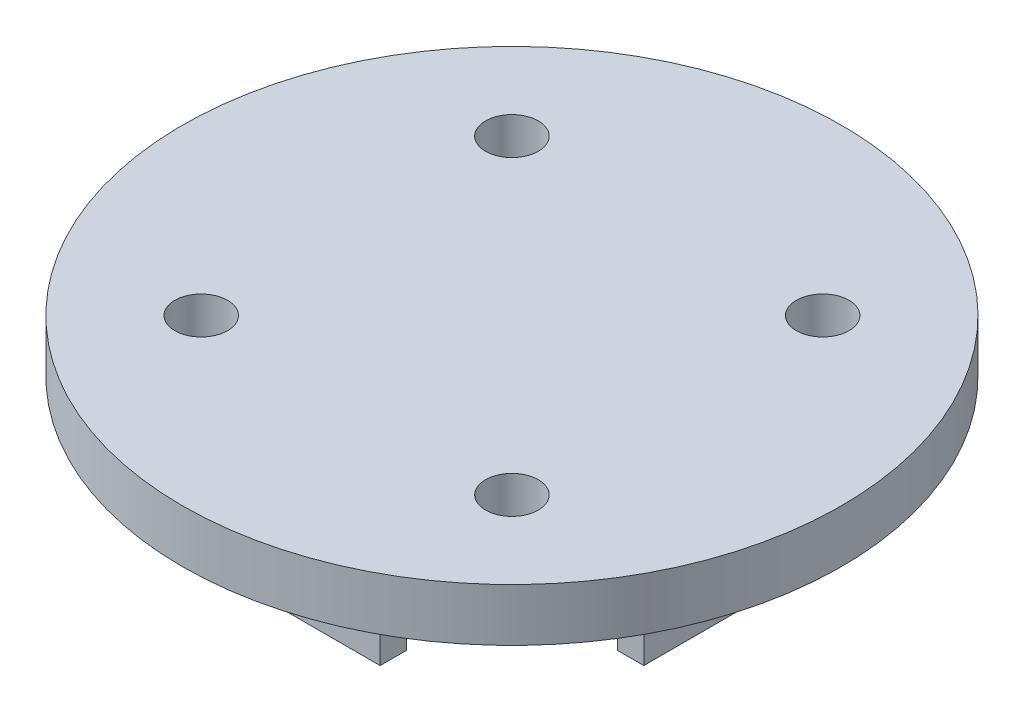
ISO-10303-21;
HEADER;
FILE_DESCRIPTION(('STEP AP214'),'2;1');
FILE_NAME('part.step','',(''),(''),'','','');
FILE_SCHEMA(('AUTOMOTIVE_DESIGN { 1 0 10303 214 1 1 1 1 }'));
ENDSEC;
DATA;
#1=APPLICATION_CONTEXT('core data for automotive mechanical design processes');
#2=APPLICATION_PROTOCOL_DEFINITION('international standard','automotive_design',2000,#1);
#3=PRODUCT_CONTEXT('',#1,'mechanical');
#4=PRODUCT('Part','Part','',(#3));
#5=PRODUCT_RELATED_PRODUCT_CATEGORY('part','',(#4));
#6=PRODUCT_DEFINITION_FORMATION('','',#4);
#7=PRODUCT_DEFINITION_CONTEXT('part definition',#1,'design');
#8=PRODUCT_DEFINITION('design','',#6,#7);
#9=PRODUCT_DEFINITION_SHAPE('','',#8);
#10=(LENGTH_UNIT() NAMED_UNIT(*) SI_UNIT(.MILLI.,.METRE.));
#11=(NAMED_UNIT(*) PLANE_ANGLE_UNIT() SI_UNIT($,.RADIAN.));
#12=(NAMED_UNIT(*) SI_UNIT($,.STERADIAN.) SOLID_ANGLE_UNIT());
#13=UNCERTAINTY_MEASURE_WITH_UNIT(LENGTH_MEASURE(1.E-05),#10,'distance_accuracy_value','');
#14=(GEOMETRIC_REPRESENTATION_CONTEXT(3) GLOBAL_UNCERTAINTY_ASSIGNED_CONTEXT((#13)) GLOBAL_UNIT_ASSIGNED_CONTEXT((#10,
#11,#12)) REPRESENTATION_CONTEXT('',''));
#15=CARTESIAN_POINT('',(0.,0.,0.));
#16=DIRECTION('',(0.,0.,1.));
#17=DIRECTION('',(1.,0.,0.));
#18=AXIS2_PLACEMENT_3D('',#15,#16,#17);
#19=CARTESIAN_POINT('',(0.,0.,0.));
#20=DIRECTION('',(0.,1.,0.));
#21=DIRECTION('',(0.,0.,1.));
#22=AXIS2_PLACEMENT_3D('',#19,#20,#21);
#23=PLANE('',#22);
#24=DIRECTION('',(1.,0.,0.));
#25=VECTOR('',#24,1.);
#26=CARTESIAN_POINT('',(21.,0.,9.));
#27=LINE('',#26,#25);
#28=CARTESIAN_POINT('',(21.,0.,9.));
#29=VERTEX_POINT('',#28);
#30=CARTESIAN_POINT('',(24.,0.,9.));
#31=VERTEX_POINT('',#30);
#32=EDGE_CURVE('E184',#29,#31,#27,.T.);
#33=ORIENTED_EDGE('',*,*,#32,.T.);
#34=DIRECTION('',(0.,0.,-1.));
#35=VECTOR('',#34,1.);
#36=CARTESIAN_POINT('',(24.,0.,-9.));
#37=LINE('',#36,#35);
#38=CARTESIAN_POINT('',(24.,0.,-9.));
#39=VERTEX_POINT('',#38);
#40=EDGE_CURVE('E157',#31,#39,#37,.T.);
#41=ORIENTED_EDGE('',*,*,#40,.T.);
#42=DIRECTION('',(-1.,0.,0.));
#43=VECTOR('',#42,1.);
#44=CARTESIAN_POINT('',(21.,0.,-9.));
#45=LINE('',#44,#43);
#46=CARTESIAN_POINT('',(21.,0.,-9.));
#47=VERTEX_POINT('',#46);
#48=EDGE_CURVE('E173',#39,#47,#45,.T.);
#49=ORIENTED_EDGE('',*,*,#48,.T.);
#50=DIRECTION('',(0.,0.,1.));
#51=VECTOR('',#50,1.);
#52=CARTESIAN_POINT('',(21.,0.,-9.));
#53=LINE('',#52,#51);
#54=EDGE_CURVE('E51',#47,#29,#53,.T.);
#55=ORIENTED_EDGE('',*,*,#54,.T.);
#56=EDGE_LOOP('',(#33,#41,#49,#55));
#57=FACE_BOUND('',#56,.T.);
#58=DIRECTION('',(-1.,0.,0.));
#59=VECTOR('',#58,1.);
#60=CARTESIAN_POINT('',(9.,0.,24.));
#61=LINE('',#60,#59);
#62=CARTESIAN_POINT('',(9.,0.,24.));
#63=VERTEX_POINT('',#62);
#64=CARTESIAN_POINT('',(-8.99999999999999,0.,24.));
#65=VERTEX_POINT('',#64);
#66=EDGE_CURVE('E208',#63,#65,#61,.T.);
#67=ORIENTED_EDGE('',*,*,#66,.F.);
#68=DIRECTION('',(0.,0.,-1.));
#69=VECTOR('',#68,1.);
#70=CARTESIAN_POINT('',(9.,0.,24.));
#71=LINE('',#70,#69);
#72=CARTESIAN_POINT('',(9.,0.,21.));
#73=VERTEX_POINT('',#72);
#74=EDGE_CURVE('E162',#63,#73,#71,.T.);
#75=ORIENTED_EDGE('',*,*,#74,.T.);
#76=DIRECTION('',(-1.,0.,0.));
#77=VECTOR('',#76,1.);
#78=CARTESIAN_POINT('',(9.,0.,21.));
#79=LINE('',#78,#77);
#80=CARTESIAN_POINT('',(-8.99999999999999,0.,21.));
#81=VERTEX_POINT('',#80);
#82=EDGE_CURVE('E198',#73,#81,#79,.T.);
#83=ORIENTED_EDGE('',*,*,#82,.T.);
#84=DIRECTION('',(0.,0.,-1.));
#85=VECTOR('',#84,1.);
#86=CARTESIAN_POINT('',(-8.99999999999999,0.,24.));
#87=LINE('',#86,#85);
#88=EDGE_CURVE('E59',#65,#81,#87,.T.);
#89=ORIENTED_EDGE('',*,*,#88,.F.);
#90=EDGE_LOOP('',(#67,#75,#83,#89));
#91=FACE_BOUND('',#90,.T.);
#92=DIRECTION('',(0.,0.,1.));
#93=VECTOR('',#92,1.);
#94=CARTESIAN_POINT('',(9.,0.,-24.));
#95=LINE('',#94,#93);
#96=CARTESIAN_POINT('',(9.,0.,-24.));
#97=VERTEX_POINT('',#96);
#98=CARTESIAN_POINT('',(9.,0.,-21.));
#99=VERTEX_POINT('',#98);
#100=EDGE_CURVE('E253',#97,#99,#95,.T.);
#101=ORIENTED_EDGE('',*,*,#100,.F.);
#102=DIRECTION('',(-1.,0.,0.));
#103=VECTOR('',#102,1.);
#104=CARTESIAN_POINT('',(9.,0.,-24.));
#105=LINE('',#104,#103);
#106=CARTESIAN_POINT('',(-8.99999999999999,0.,-24.));
#107=VERTEX_POINT('',#106);
#108=EDGE_CURVE('E258',#97,#107,#105,.T.);
#109=ORIENTED_EDGE('',*,*,#108,.T.);
#110=DIRECTION('',(0.,0.,1.));
#111=VECTOR('',#110,1.);
#112=CARTESIAN_POINT('',(-8.99999999999999,0.,-24.));
#113=LINE('',#112,#111);
#114=CARTESIAN_POINT('',(-8.99999999999999,0.,-21.));
#115=VERTEX_POINT('',#114);
#116=EDGE_CURVE('E272',#107,#115,#113,.T.);
#117=ORIENTED_EDGE('',*,*,#116,.T.);
#118=DIRECTION('',(-1.,0.,0.));
#119=VECTOR('',#118,1.);
#120=CARTESIAN_POINT('',(9.,0.,-21.));
#121=LINE('',#120,#119);
#122=EDGE_CURVE('E269',#99,#115,#121,.T.);
#123=ORIENTED_EDGE('',*,*,#122,.F.);
#124=EDGE_LOOP('',(#101,#109,#117,#123));
#125=FACE_BOUND('',#124,.T.);
#126=CARTESIAN_POINT('',(-17.6776695296636,0.,17.6776695296637));
#127=DIRECTION('',(0.,1.,0.));
#128=DIRECTION('',(1.,0.,0.));
#129=AXIS2_PLACEMENT_3D('',#126,#127,#128);
#130=CIRCLE('',#129,3.);
#131=CARTESIAN_POINT('',(-14.6776695296636,0.,17.6776695296637));
#132=VERTEX_POINT('',#131);
#133=EDGE_CURVE('E290',#132,#132,#130,.T.);
#134=ORIENTED_EDGE('',*,*,#133,.T.);
#135=EDGE_LOOP('',(#134));
#136=FACE_BOUND('',#135,.T.);
#137=CARTESIAN_POINT('',(17.6776695296637,0.,17.6776695296637));
#138=DIRECTION('',(0.,1.,0.));
#139=DIRECTION('',(0.,0.,-1.));
#140=AXIS2_PLACEMENT_3D('',#137,#138,#139);
#141=CIRCLE('',#140,3.);
#142=CARTESIAN_POINT('',(17.6776695296637,0.,14.6776695296637));
#143=VERTEX_POINT('',#142);
#144=EDGE_CURVE('E296',#143,#143,#141,.T.);
#145=ORIENTED_EDGE('',*,*,#144,.T.);
#146=EDGE_LOOP('',(#145));
#147=FACE_BOUND('',#146,.T.);
#148=CARTESIAN_POINT('',(17.6776695296635,0.,-17.6776695296639));
#149=DIRECTION('',(0.,1.,0.));
#150=DIRECTION('',(-1.,0.,0.));
#151=AXIS2_PLACEMENT_3D('',#148,#149,#150);
#152=CIRCLE('',#151,3.);
#153=CARTESIAN_POINT('',(14.6776695296635,0.,-17.6776695296638));
#154=VERTEX_POINT('',#153);
#155=EDGE_CURVE('E285',#154,#154,#152,.T.);
#156=ORIENTED_EDGE('',*,*,#155,.T.);
#157=EDGE_LOOP('',(#156));
#158=FACE_BOUND('',#157,.T.);
#159=CARTESIAN_POINT('',(-17.6776695296637,0.,-17.6776695296637));
#160=DIRECTION('',(0.,1.,0.));
#161=DIRECTION('',(0.,0.,1.));
#162=AXIS2_PLACEMENT_3D('',#159,#160,#161);
#163=CIRCLE('',#162,3.);
#164=CARTESIAN_POINT('',(-17.6776695296637,0.,-14.6776695296637));
#165=VERTEX_POINT('',#164);
#166=EDGE_CURVE('E289',#165,#165,#163,.T.);
#167=ORIENTED_EDGE('',*,*,#166,.T.);
#168=EDGE_LOOP('',(#167));
#169=FACE_BOUND('',#168,.T.);
#170=CARTESIAN_POINT('',(0.,0.,0.));
#171=DIRECTION('',(0.,1.,0.));
#172=DIRECTION('',(0.,0.,1.));
#173=AXIS2_PLACEMENT_3D('',#170,#171,#172);
#174=CIRCLE('',#173,37.5);
#175=CARTESIAN_POINT('',(0.,0.,37.5));
#176=VERTEX_POINT('',#175);
#177=EDGE_CURVE('E43',#176,#176,#174,.T.);
#178=ORIENTED_EDGE('',*,*,#177,.F.);
#179=EDGE_LOOP('',(#178));
#180=FACE_BOUND('',#179,.T.);
#181=DIRECTION('',(0.,0.,-1.));
#182=VECTOR('',#181,1.);
#183=CARTESIAN_POINT('',(-24.,0.,-9.));
#184=LINE('',#183,#182);
#185=CARTESIAN_POINT('',(-24.,0.,9.));
#186=VERTEX_POINT('',#185);
#187=CARTESIAN_POINT('',(-24.,0.,-9.));
#188=VERTEX_POINT('',#187);
#189=EDGE_CURVE('E220',#186,#188,#184,.T.);
#190=ORIENTED_EDGE('',*,*,#189,.F.);
#191=DIRECTION('',(-1.,0.,0.));
#192=VECTOR('',#191,1.);
#193=CARTESIAN_POINT('',(-21.,0.,9.));
#194=LINE('',#193,#192);
#195=CARTESIAN_POINT('',(-21.,0.,9.));
#196=VERTEX_POINT('',#195);
#197=EDGE_CURVE('E225',#196,#186,#194,.T.);
#198=ORIENTED_EDGE('',*,*,#197,.F.);
#199=DIRECTION('',(0.,0.,1.));
#200=VECTOR('',#199,1.);
#201=CARTESIAN_POINT('',(-21.,0.,-9.));
#202=LINE('',#201,#200);
#203=CARTESIAN_POINT('',(-21.,0.,-9.));
#204=VERTEX_POINT('',#203);
#205=EDGE_CURVE('E237',#204,#196,#202,.T.);
#206=ORIENTED_EDGE('',*,*,#205,.F.);
#207=DIRECTION('',(1.,0.,0.));
#208=VECTOR('',#207,1.);
#209=CARTESIAN_POINT('',(-21.,0.,-9.));
#210=LINE('',#209,#208);
#211=EDGE_CURVE('E234',#188,#204,#210,.T.);
#212=ORIENTED_EDGE('',*,*,#211,.F.);
#213=EDGE_LOOP('',(#190,#198,#206,#212));
#214=FACE_BOUND('',#213,.T.);
#215=ADVANCED_FACE('F34',(#57,#91,#125,#136,#147,#158,#169,#180,#214),#23,.F.);
#216=CARTESIAN_POINT('',(0.,6.,0.));
#217=DIRECTION('',(0.,-1.,0.));
#218=DIRECTION('',(0.,0.,-1.));
#219=AXIS2_PLACEMENT_3D('',#216,#217,#218);
#220=CYLINDRICAL_SURFACE('',#219,37.5);
#221=CARTESIAN_POINT('',(0.,6.,0.));
#222=DIRECTION('',(0.,1.,0.));
#223=DIRECTION('',(0.,0.,1.));
#224=AXIS2_PLACEMENT_3D('',#221,#222,#223);
#225=CIRCLE('',#224,37.5);
#226=CARTESIAN_POINT('',(0.,6.,37.5));
#227=VERTEX_POINT('',#226);
#228=EDGE_CURVE('E11',#227,#227,#225,.T.);
#229=ORIENTED_EDGE('',*,*,#228,.F.);
#230=EDGE_LOOP('',(#229));
#231=FACE_BOUND('',#230,.T.);
#232=ORIENTED_EDGE('',*,*,#177,.T.);
#233=EDGE_LOOP('',(#232));
#234=FACE_BOUND('',#233,.T.);
#235=ADVANCED_FACE('F36',(#231,#234),#220,.T.);
#236=CARTESIAN_POINT('',(0.,6.,0.));
#237=DIRECTION('',(0.,1.,0.));
#238=DIRECTION('',(0.,0.,1.));
#239=AXIS2_PLACEMENT_3D('',#236,#237,#238);
#240=PLANE('',#239);
#241=CARTESIAN_POINT('',(-17.6776695296636,6.,17.6776695296637));
#242=DIRECTION('',(0.,1.,0.));
#243=DIRECTION('',(1.,0.,0.));
#244=AXIS2_PLACEMENT_3D('',#241,#242,#243);
#245=CIRCLE('',#244,3.);
#246=CARTESIAN_POINT('',(-14.6776695296636,6.,17.6776695296637));
#247=VERTEX_POINT('',#246);
#248=EDGE_CURVE('E286',#247,#247,#245,.T.);
#249=ORIENTED_EDGE('',*,*,#248,.F.);
#250=EDGE_LOOP('',(#249));
#251=FACE_BOUND('',#250,.T.);
#252=CARTESIAN_POINT('',(17.6776695296637,6.,17.6776695296637));
#253=DIRECTION('',(0.,1.,0.));
#254=DIRECTION('',(0.,0.,-1.));
#255=AXIS2_PLACEMENT_3D('',#252,#253,#254);
#256=CIRCLE('',#255,3.);
#257=CARTESIAN_POINT('',(17.6776695296637,6.,14.6776695296637));
#258=VERTEX_POINT('',#257);
#259=EDGE_CURVE('E293',#258,#258,#256,.T.);
#260=ORIENTED_EDGE('',*,*,#259,.F.);
#261=EDGE_LOOP('',(#260));
#262=FACE_BOUND('',#261,.T.);
#263=CARTESIAN_POINT('',(17.6776695296635,6.,-17.6776695296639));
#264=DIRECTION('',(0.,1.,0.));
#265=DIRECTION('',(-1.,0.,0.));
#266=AXIS2_PLACEMENT_3D('',#263,#264,#265);
#267=CIRCLE('',#266,3.);
#268=CARTESIAN_POINT('',(14.6776695296635,6.,-17.6776695296638));
#269=VERTEX_POINT('',#268);
#270=EDGE_CURVE('E299',#269,#269,#267,.T.);
#271=ORIENTED_EDGE('',*,*,#270,.F.);
#272=EDGE_LOOP('',(#271));
#273=FACE_BOUND('',#272,.T.);
#274=CARTESIAN_POINT('',(-17.6776695296637,6.,-17.6776695296637));
#275=DIRECTION('',(0.,1.,0.));
#276=DIRECTION('',(0.,0.,1.));
#277=AXIS2_PLACEMENT_3D('',#274,#275,#276);
#278=CIRCLE('',#277,3.);
#279=CARTESIAN_POINT('',(-17.6776695296637,6.,-14.6776695296637));
#280=VERTEX_POINT('',#279);
#281=EDGE_CURVE('E304',#280,#280,#278,.T.);
#282=ORIENTED_EDGE('',*,*,#281,.F.);
#283=EDGE_LOOP('',(#282));
#284=FACE_BOUND('',#283,.T.);
#285=ORIENTED_EDGE('',*,*,#228,.T.);
#286=EDGE_LOOP('',(#285));
#287=FACE_BOUND('',#286,.T.);
#288=ADVANCED_FACE('F352',(#251,#262,#273,#284,#287),#240,.T.);
#289=CARTESIAN_POINT('',(-17.6776695296637,6.,-17.6776695296637));
#290=DIRECTION('',(0.,-1.,0.));
#291=DIRECTION('',(0.,0.,-1.));
#292=AXIS2_PLACEMENT_3D('',#289,#290,#291);
#293=CYLINDRICAL_SURFACE('',#292,3.);
#294=ORIENTED_EDGE('',*,*,#281,.T.);
#295=EDGE_LOOP('',(#294));
#296=FACE_BOUND('',#295,.T.);
#297=ORIENTED_EDGE('',*,*,#166,.F.);
#298=EDGE_LOOP('',(#297));
#299=FACE_BOUND('',#298,.T.);
#300=ADVANCED_FACE('F358',(#296,#299),#293,.F.);
#301=CARTESIAN_POINT('',(17.6776695296635,6.,-17.6776695296639));
#302=DIRECTION('',(0.,-1.,0.));
#303=DIRECTION('',(0.,0.,-1.));
#304=AXIS2_PLACEMENT_3D('',#301,#302,#303);
#305=CYLINDRICAL_SURFACE('',#304,3.);
#306=ORIENTED_EDGE('',*,*,#270,.T.);
#307=EDGE_LOOP('',(#306));
#308=FACE_BOUND('',#307,.T.);
#309=ORIENTED_EDGE('',*,*,#155,.F.);
#310=EDGE_LOOP('',(#309));
#311=FACE_BOUND('',#310,.T.);
#312=ADVANCED_FACE('F362',(#308,#311),#305,.F.);
#313=CARTESIAN_POINT('',(17.6776695296637,6.,17.6776695296637));
#314=DIRECTION('',(0.,-1.,0.));
#315=DIRECTION('',(0.,0.,-1.));
#316=AXIS2_PLACEMENT_3D('',#313,#314,#315);
#317=CYLINDRICAL_SURFACE('',#316,3.);
#318=ORIENTED_EDGE('',*,*,#259,.T.);
#319=EDGE_LOOP('',(#318));
#320=FACE_BOUND('',#319,.T.);
#321=ORIENTED_EDGE('',*,*,#144,.F.);
#322=EDGE_LOOP('',(#321));
#323=FACE_BOUND('',#322,.T.);
#324=ADVANCED_FACE('F366',(#320,#323),#317,.F.);
#325=CARTESIAN_POINT('',(-17.6776695296636,6.,17.6776695296637));
#326=DIRECTION('',(0.,-1.,0.));
#327=DIRECTION('',(0.,0.,-1.));
#328=AXIS2_PLACEMENT_3D('',#325,#326,#327);
#329=CYLINDRICAL_SURFACE('',#328,3.);
#330=ORIENTED_EDGE('',*,*,#248,.T.);
#331=EDGE_LOOP('',(#330));
#332=FACE_BOUND('',#331,.T.);
#333=ORIENTED_EDGE('',*,*,#133,.F.);
#334=EDGE_LOOP('',(#333));
#335=FACE_BOUND('',#334,.T.);
#336=ADVANCED_FACE('F370',(#332,#335),#329,.F.);
#337=CARTESIAN_POINT('',(9.,-12.,-24.));
#338=DIRECTION('',(-1.,0.,0.));
#339=DIRECTION('',(0.,0.,1.));
#340=AXIS2_PLACEMENT_3D('',#337,#338,#339);
#341=PLANE('',#340);
#342=ORIENTED_EDGE('',*,*,#100,.T.);
#343=DIRECTION('',(0.,1.,0.));
#344=VECTOR('',#343,1.);
#345=CARTESIAN_POINT('',(9.,-12.,-21.));
#346=LINE('',#345,#344);
#347=CARTESIAN_POINT('',(9.,-12.,-21.));
#348=VERTEX_POINT('',#347);
#349=EDGE_CURVE('E283',#348,#99,#346,.T.);
#350=ORIENTED_EDGE('',*,*,#349,.F.);
#351=DIRECTION('',(0.,0.,1.));
#352=VECTOR('',#351,1.);
#353=CARTESIAN_POINT('',(9.,-12.,-24.));
#354=LINE('',#353,#352);
#355=CARTESIAN_POINT('',(9.,-12.,-24.));
#356=VERTEX_POINT('',#355);
#357=EDGE_CURVE('E254',#356,#348,#354,.T.);
#358=ORIENTED_EDGE('',*,*,#357,.F.);
#359=DIRECTION('',(0.,1.,0.));
#360=VECTOR('',#359,1.);
#361=CARTESIAN_POINT('',(9.,-12.,-24.));
#362=LINE('',#361,#360);
#363=EDGE_CURVE('E266',#356,#97,#362,.T.);
#364=ORIENTED_EDGE('',*,*,#363,.T.);
#365=EDGE_LOOP('',(#342,#350,#358,#364));
#366=FACE_BOUND('',#365,.T.);
#367=ADVANCED_FACE('F374',(#366),#341,.F.);
#368=CARTESIAN_POINT('',(9.,-12.,-21.));
#369=DIRECTION('',(0.,0.,-1.));
#370=DIRECTION('',(-1.,0.,0.));
#371=AXIS2_PLACEMENT_3D('',#368,#369,#370);
#372=PLANE('',#371);
#373=CARTESIAN_POINT('',(0.,-6.,-21.));
#374=DIRECTION('',(0.,0.,-1.));
#375=DIRECTION('',(-1.,0.,0.));
#376=AXIS2_PLACEMENT_3D('',#373,#374,#375);
#377=CIRCLE('',#376,2.1);
#378=CARTESIAN_POINT('',(-2.09999999999999,-6.,-21.));
#379=VERTEX_POINT('',#378);
#380=EDGE_CURVE('E185',#379,#379,#377,.T.);
#381=ORIENTED_EDGE('',*,*,#380,.T.);
#382=EDGE_LOOP('',(#381));
#383=FACE_BOUND('',#382,.T.);
#384=ORIENTED_EDGE('',*,*,#122,.T.);
#385=DIRECTION('',(0.,1.,0.));
#386=VECTOR('',#385,1.);
#387=CARTESIAN_POINT('',(-8.99999999999999,-12.,-21.));
#388=LINE('',#387,#386);
#389=CARTESIAN_POINT('',(-8.99999999999999,-12.,-21.));
#390=VERTEX_POINT('',#389);
#391=EDGE_CURVE('E281',#390,#115,#388,.T.);
#392=ORIENTED_EDGE('',*,*,#391,.F.);
#393=DIRECTION('',(-1.,0.,0.));
#394=VECTOR('',#393,1.);
#395=CARTESIAN_POINT('',(9.,-12.,-21.));
#396=LINE('',#395,#394);
#397=EDGE_CURVE('E257',#348,#390,#396,.T.);
#398=ORIENTED_EDGE('',*,*,#397,.F.);
#399=ORIENTED_EDGE('',*,*,#349,.T.);
#400=EDGE_LOOP('',(#384,#392,#398,#399));
#401=FACE_BOUND('',#400,.T.);
#402=ADVANCED_FACE('F330',(#383,#401),#372,.F.);
#403=CARTESIAN_POINT('',(-8.99999999999999,-12.,-24.));
#404=DIRECTION('',(-1.,0.,0.));
#405=DIRECTION('',(0.,0.,1.));
#406=AXIS2_PLACEMENT_3D('',#403,#404,#405);
#407=PLANE('',#406);
#408=ORIENTED_EDGE('',*,*,#116,.F.);
#409=DIRECTION('',(0.,1.,0.));
#410=VECTOR('',#409,1.);
#411=CARTESIAN_POINT('',(-8.99999999999999,-12.,-24.));
#412=LINE('',#411,#410);
#413=CARTESIAN_POINT('',(-8.99999999999999,-12.,-24.));
#414=VERTEX_POINT('',#413);
#415=EDGE_CURVE('E278',#414,#107,#412,.T.);
#416=ORIENTED_EDGE('',*,*,#415,.F.);
#417=DIRECTION('',(0.,0.,1.));
#418=VECTOR('',#417,1.);
#419=CARTESIAN_POINT('',(-8.99999999999999,-12.,-24.));
#420=LINE('',#419,#418);
#421=EDGE_CURVE('E260',#414,#390,#420,.T.);
#422=ORIENTED_EDGE('',*,*,#421,.T.);
#423=ORIENTED_EDGE('',*,*,#391,.T.);
#424=EDGE_LOOP('',(#408,#416,#422,#423));
#425=FACE_BOUND('',#424,.T.);
#426=ADVANCED_FACE('F381',(#425),#407,.T.);
#427=CARTESIAN_POINT('',(9.,-12.,-24.));
#428=DIRECTION('',(0.,0.,-1.));
#429=DIRECTION('',(-1.,0.,0.));
#430=AXIS2_PLACEMENT_3D('',#427,#428,#429);
#431=PLANE('',#430);
#432=CARTESIAN_POINT('',(0.,-6.,-24.));
#433=DIRECTION('',(0.,0.,-1.));
#434=DIRECTION('',(-1.,0.,0.));
#435=AXIS2_PLACEMENT_3D('',#432,#433,#434);
#436=CIRCLE('',#435,2.1);
#437=CARTESIAN_POINT('',(-2.09999999999999,-6.,-24.));
#438=VERTEX_POINT('',#437);
#439=EDGE_CURVE('E312',#438,#438,#436,.T.);
#440=ORIENTED_EDGE('',*,*,#439,.F.);
#441=EDGE_LOOP('',(#440));
#442=FACE_BOUND('',#441,.T.);
#443=ORIENTED_EDGE('',*,*,#108,.F.);
#444=ORIENTED_EDGE('',*,*,#363,.F.);
#445=DIRECTION('',(-1.,0.,0.));
#446=VECTOR('',#445,1.);
#447=CARTESIAN_POINT('',(9.,-12.,-24.));
#448=LINE('',#447,#446);
#449=EDGE_CURVE('E263',#356,#414,#448,.T.);
#450=ORIENTED_EDGE('',*,*,#449,.T.);
#451=ORIENTED_EDGE('',*,*,#415,.T.);
#452=EDGE_LOOP('',(#443,#444,#450,#451));
#453=FACE_BOUND('',#452,.T.);
#454=ADVANCED_FACE('F384',(#442,#453),#431,.T.);
#455=CARTESIAN_POINT('',(0.,-12.,0.));
#456=DIRECTION('',(0.,-1.,0.));
#457=DIRECTION('',(0.,0.,-1.));
#458=AXIS2_PLACEMENT_3D('',#455,#456,#457);
#459=PLANE('',#458);
#460=ORIENTED_EDGE('',*,*,#357,.T.);
#461=ORIENTED_EDGE('',*,*,#397,.T.);
#462=ORIENTED_EDGE('',*,*,#421,.F.);
#463=ORIENTED_EDGE('',*,*,#449,.F.);
#464=EDGE_LOOP('',(#460,#461,#462,#463));
#465=FACE_BOUND('',#464,.T.);
#466=ADVANCED_FACE('F388',(#465),#459,.T.);
#467=CARTESIAN_POINT('',(-24.,-12.,-9.));
#468=DIRECTION('',(1.,0.,0.));
#469=DIRECTION('',(0.,0.,-1.));
#470=AXIS2_PLACEMENT_3D('',#467,#468,#469);
#471=PLANE('',#470);
#472=CARTESIAN_POINT('',(-24.,-6.,0.));
#473=DIRECTION('',(1.,0.,0.));
#474=DIRECTION('',(0.,0.,-1.));
#475=AXIS2_PLACEMENT_3D('',#472,#473,#474);
#476=CIRCLE('',#475,2.1);
#477=CARTESIAN_POINT('',(-24.,-6.,-2.1));
#478=VERTEX_POINT('',#477);
#479=EDGE_CURVE('E319',#478,#478,#476,.T.);
#480=ORIENTED_EDGE('',*,*,#479,.T.);
#481=EDGE_LOOP('',(#480));
#482=FACE_BOUND('',#481,.T.);
#483=ORIENTED_EDGE('',*,*,#189,.T.);
#484=DIRECTION('',(0.,1.,0.));
#485=VECTOR('',#484,1.);
#486=CARTESIAN_POINT('',(-24.,-12.,-9.));
#487=LINE('',#486,#485);
#488=CARTESIAN_POINT('',(-24.,-12.,-9.));
#489=VERTEX_POINT('',#488);
#490=EDGE_CURVE('E250',#489,#188,#487,.T.);
#491=ORIENTED_EDGE('',*,*,#490,.F.);
#492=DIRECTION('',(0.,0.,-1.));
#493=VECTOR('',#492,1.);
#494=CARTESIAN_POINT('',(-24.,-12.,-9.));
#495=LINE('',#494,#493);
#496=CARTESIAN_POINT('',(-24.,-12.,9.));
#497=VERTEX_POINT('',#496);
#498=EDGE_CURVE('E221',#497,#489,#495,.T.);
#499=ORIENTED_EDGE('',*,*,#498,.F.);
#500=DIRECTION('',(0.,1.,0.));
#501=VECTOR('',#500,1.);
#502=CARTESIAN_POINT('',(-24.,-12.,9.));
#503=LINE('',#502,#501);
#504=EDGE_CURVE('E231',#497,#186,#503,.T.);
#505=ORIENTED_EDGE('',*,*,#504,.T.);
#506=EDGE_LOOP('',(#483,#491,#499,#505));
#507=FACE_BOUND('',#506,.T.);
#508=ADVANCED_FACE('F392',(#482,#507),#471,.F.);
#509=CARTESIAN_POINT('',(-21.,-12.,-9.));
#510=DIRECTION('',(0.,0.,1.));
#511=DIRECTION('',(1.,0.,0.));
#512=AXIS2_PLACEMENT_3D('',#509,#510,#511);
#513=PLANE('',#512);
#514=ORIENTED_EDGE('',*,*,#211,.T.);
#515=DIRECTION('',(0.,1.,0.));
#516=VECTOR('',#515,1.);
#517=CARTESIAN_POINT('',(-21.,-12.,-9.));
#518=LINE('',#517,#516);
#519=CARTESIAN_POINT('',(-21.,-12.,-9.));
#520=VERTEX_POINT('',#519);
#521=EDGE_CURVE('E247',#520,#204,#518,.T.);
#522=ORIENTED_EDGE('',*,*,#521,.F.);
#523=DIRECTION('',(1.,0.,0.));
#524=VECTOR('',#523,1.);
#525=CARTESIAN_POINT('',(-21.,-12.,-9.));
#526=LINE('',#525,#524);
#527=EDGE_CURVE('E224',#489,#520,#526,.T.);
#528=ORIENTED_EDGE('',*,*,#527,.F.);
#529=ORIENTED_EDGE('',*,*,#490,.T.);
#530=EDGE_LOOP('',(#514,#522,#528,#529));
#531=FACE_BOUND('',#530,.T.);
#532=ADVANCED_FACE('F396',(#531),#513,.F.);
#533=CARTESIAN_POINT('',(-21.,-12.,-9.));
#534=DIRECTION('',(-1.,0.,0.));
#535=DIRECTION('',(0.,0.,1.));
#536=AXIS2_PLACEMENT_3D('',#533,#534,#535);
#537=PLANE('',#536);
#538=CARTESIAN_POINT('',(-21.,-6.,0.));
#539=DIRECTION('',(-1.,0.,0.));
#540=DIRECTION('',(0.,0.,1.));
#541=AXIS2_PLACEMENT_3D('',#538,#539,#540);
#542=CIRCLE('',#541,2.1);
#543=CARTESIAN_POINT('',(-21.,-6.,2.1));
#544=VERTEX_POINT('',#543);
#545=EDGE_CURVE('E324',#544,#544,#542,.T.);
#546=ORIENTED_EDGE('',*,*,#545,.T.);
#547=EDGE_LOOP('',(#546));
#548=FACE_BOUND('',#547,.T.);
#549=ORIENTED_EDGE('',*,*,#205,.T.);
#550=DIRECTION('',(0.,1.,0.));
#551=VECTOR('',#550,1.);
#552=CARTESIAN_POINT('',(-21.,-12.,9.));
#553=LINE('',#552,#551);
#554=CARTESIAN_POINT('',(-21.,-12.,9.));
#555=VERTEX_POINT('',#554);
#556=EDGE_CURVE('E244',#555,#196,#553,.T.);
#557=ORIENTED_EDGE('',*,*,#556,.F.);
#558=DIRECTION('',(0.,0.,1.));
#559=VECTOR('',#558,1.);
#560=CARTESIAN_POINT('',(-21.,-12.,-9.));
#561=LINE('',#560,#559);
#562=EDGE_CURVE('E227',#520,#555,#561,.T.);
#563=ORIENTED_EDGE('',*,*,#562,.F.);
#564=ORIENTED_EDGE('',*,*,#521,.T.);
#565=EDGE_LOOP('',(#549,#557,#563,#564));
#566=FACE_BOUND('',#565,.T.);
#567=ADVANCED_FACE('F400',(#548,#566),#537,.F.);
#568=CARTESIAN_POINT('',(-21.,-12.,9.));
#569=DIRECTION('',(0.,0.,-1.));
#570=DIRECTION('',(-1.,0.,0.));
#571=AXIS2_PLACEMENT_3D('',#568,#569,#570);
#572=PLANE('',#571);
#573=ORIENTED_EDGE('',*,*,#197,.T.);
#574=ORIENTED_EDGE('',*,*,#504,.F.);
#575=DIRECTION('',(-1.,0.,0.));
#576=VECTOR('',#575,1.);
#577=CARTESIAN_POINT('',(-21.,-12.,9.));
#578=LINE('',#577,#576);
#579=EDGE_CURVE('E229',#555,#497,#578,.T.);
#580=ORIENTED_EDGE('',*,*,#579,.F.);
#581=ORIENTED_EDGE('',*,*,#556,.T.);
#582=EDGE_LOOP('',(#573,#574,#580,#581));
#583=FACE_BOUND('',#582,.T.);
#584=ADVANCED_FACE('F404',(#583),#572,.F.);
#585=CARTESIAN_POINT('',(0.,-12.,0.));
#586=DIRECTION('',(0.,-1.,0.));
#587=DIRECTION('',(0.,0.,-1.));
#588=AXIS2_PLACEMENT_3D('',#585,#586,#587);
#589=PLANE('',#588);
#590=ORIENTED_EDGE('',*,*,#498,.T.);
#591=ORIENTED_EDGE('',*,*,#527,.T.);
#592=ORIENTED_EDGE('',*,*,#562,.T.);
#593=ORIENTED_EDGE('',*,*,#579,.T.);
#594=EDGE_LOOP('',(#590,#591,#592,#593));
#595=FACE_BOUND('',#594,.T.);
#596=ADVANCED_FACE('F408',(#595),#589,.T.);
#597=CARTESIAN_POINT('',(9.,-12.,24.));
#598=DIRECTION('',(1.,0.,0.));
#599=DIRECTION('',(0.,0.,-1.));
#600=AXIS2_PLACEMENT_3D('',#597,#598,#599);
#601=PLANE('',#600);
#602=ORIENTED_EDGE('',*,*,#74,.F.);
#603=DIRECTION('',(0.,1.,0.));
#604=VECTOR('',#603,1.);
#605=CARTESIAN_POINT('',(9.,-12.,24.));
#606=LINE('',#605,#604);
#607=CARTESIAN_POINT('',(9.,-12.,24.));
#608=VERTEX_POINT('',#607);
#609=EDGE_CURVE('E218',#608,#63,#606,.T.);
#610=ORIENTED_EDGE('',*,*,#609,.F.);
#611=DIRECTION('',(0.,0.,-1.));
#612=VECTOR('',#611,1.);
#613=CARTESIAN_POINT('',(9.,-12.,24.));
#614=LINE('',#613,#612);
#615=CARTESIAN_POINT('',(9.,-12.,21.));
#616=VERTEX_POINT('',#615);
#617=EDGE_CURVE('E194',#608,#616,#614,.T.);
#618=ORIENTED_EDGE('',*,*,#617,.T.);
#619=DIRECTION('',(0.,1.,0.));
#620=VECTOR('',#619,1.);
#621=CARTESIAN_POINT('',(9.,-12.,21.));
#622=LINE('',#621,#620);
#623=EDGE_CURVE('E205',#616,#73,#622,.T.);
#624=ORIENTED_EDGE('',*,*,#623,.T.);
#625=EDGE_LOOP('',(#602,#610,#618,#624));
#626=FACE_BOUND('',#625,.T.);
#627=ADVANCED_FACE('F412',(#626),#601,.T.);
#628=CARTESIAN_POINT('',(9.,-12.,24.));
#629=DIRECTION('',(0.,0.,-1.));
#630=DIRECTION('',(-1.,0.,0.));
#631=AXIS2_PLACEMENT_3D('',#628,#629,#630);
#632=PLANE('',#631);
#633=CARTESIAN_POINT('',(0.,-6.,24.));
#634=DIRECTION('',(0.,0.,1.));
#635=DIRECTION('',(1.,0.,0.));
#636=AXIS2_PLACEMENT_3D('',#633,#634,#635);
#637=CIRCLE('',#636,2.1);
#638=CARTESIAN_POINT('',(2.10000000000001,-6.,24.));
#639=VERTEX_POINT('',#638);
#640=EDGE_CURVE('E313',#639,#639,#637,.T.);
#641=ORIENTED_EDGE('',*,*,#640,.F.);
#642=EDGE_LOOP('',(#641));
#643=FACE_BOUND('',#642,.T.);
#644=ORIENTED_EDGE('',*,*,#66,.T.);
#645=DIRECTION('',(0.,1.,0.));
#646=VECTOR('',#645,1.);
#647=CARTESIAN_POINT('',(-8.99999999999999,-12.,24.));
#648=LINE('',#647,#646);
#649=CARTESIAN_POINT('',(-8.99999999999999,-12.,24.));
#650=VERTEX_POINT('',#649);
#651=EDGE_CURVE('E216',#650,#65,#648,.T.);
#652=ORIENTED_EDGE('',*,*,#651,.F.);
#653=DIRECTION('',(-1.,0.,0.));
#654=VECTOR('',#653,1.);
#655=CARTESIAN_POINT('',(9.,-12.,24.));
#656=LINE('',#655,#654);
#657=EDGE_CURVE('E197',#608,#650,#656,.T.);
#658=ORIENTED_EDGE('',*,*,#657,.F.);
#659=ORIENTED_EDGE('',*,*,#609,.T.);
#660=EDGE_LOOP('',(#644,#652,#658,#659));
#661=FACE_BOUND('',#660,.T.);
#662=ADVANCED_FACE('F416',(#643,#661),#632,.F.);
#663=CARTESIAN_POINT('',(-8.99999999999999,-12.,24.));
#664=DIRECTION('',(1.,0.,0.));
#665=DIRECTION('',(0.,0.,-1.));
#666=AXIS2_PLACEMENT_3D('',#663,#664,#665);
#667=PLANE('',#666);
#668=ORIENTED_EDGE('',*,*,#88,.T.);
#669=DIRECTION('',(0.,1.,0.));
#670=VECTOR('',#669,1.);
#671=CARTESIAN_POINT('',(-8.99999999999999,-12.,21.));
#672=LINE('',#671,#670);
#673=CARTESIAN_POINT('',(-8.99999999999999,-12.,21.));
#674=VERTEX_POINT('',#673);
#675=EDGE_CURVE('E214',#674,#81,#672,.T.);
#676=ORIENTED_EDGE('',*,*,#675,.F.);
#677=DIRECTION('',(0.,0.,-1.));
#678=VECTOR('',#677,1.);
#679=CARTESIAN_POINT('',(-8.99999999999999,-12.,24.));
#680=LINE('',#679,#678);
#681=EDGE_CURVE('E200',#650,#674,#680,.T.);
#682=ORIENTED_EDGE('',*,*,#681,.F.);
#683=ORIENTED_EDGE('',*,*,#651,.T.);
#684=EDGE_LOOP('',(#668,#676,#682,#683));
#685=FACE_BOUND('',#684,.T.);
#686=ADVANCED_FACE('F420',(#685),#667,.F.);
#687=CARTESIAN_POINT('',(9.,-12.,21.));
#688=DIRECTION('',(0.,0.,-1.));
#689=DIRECTION('',(-1.,0.,0.));
#690=AXIS2_PLACEMENT_3D('',#687,#688,#689);
#691=PLANE('',#690);
#692=CARTESIAN_POINT('',(0.,-6.,21.));
#693=DIRECTION('',(0.,0.,-1.));
#694=DIRECTION('',(-1.,0.,0.));
#695=AXIS2_PLACEMENT_3D('',#692,#693,#694);
#696=CIRCLE('',#695,2.1);
#697=CARTESIAN_POINT('',(-2.09999999999999,-6.,21.));
#698=VERTEX_POINT('',#697);
#699=EDGE_CURVE('E310',#698,#698,#696,.T.);
#700=ORIENTED_EDGE('',*,*,#699,.F.);
#701=EDGE_LOOP('',(#700));
#702=FACE_BOUND('',#701,.T.);
#703=ORIENTED_EDGE('',*,*,#82,.F.);
#704=ORIENTED_EDGE('',*,*,#623,.F.);
#705=DIRECTION('',(-1.,0.,0.));
#706=VECTOR('',#705,1.);
#707=CARTESIAN_POINT('',(9.,-12.,21.));
#708=LINE('',#707,#706);
#709=EDGE_CURVE('E202',#616,#674,#708,.T.);
#710=ORIENTED_EDGE('',*,*,#709,.T.);
#711=ORIENTED_EDGE('',*,*,#675,.T.);
#712=EDGE_LOOP('',(#703,#704,#710,#711));
#713=FACE_BOUND('',#712,.T.);
#714=ADVANCED_FACE('F424',(#702,#713),#691,.T.);
#715=CARTESIAN_POINT('',(0.,-12.,0.));
#716=DIRECTION('',(0.,-1.,0.));
#717=DIRECTION('',(0.,0.,1.));
#718=AXIS2_PLACEMENT_3D('',#715,#716,#717);
#719=PLANE('',#718);
#720=ORIENTED_EDGE('',*,*,#617,.F.);
#721=ORIENTED_EDGE('',*,*,#657,.T.);
#722=ORIENTED_EDGE('',*,*,#681,.T.);
#723=ORIENTED_EDGE('',*,*,#709,.F.);
#724=EDGE_LOOP('',(#720,#721,#722,#723));
#725=FACE_BOUND('',#724,.T.);
#726=ADVANCED_FACE('F427',(#725),#719,.T.);
#727=CARTESIAN_POINT('',(24.,-12.,-9.));
#728=DIRECTION('',(1.,0.,0.));
#729=DIRECTION('',(0.,0.,-1.));
#730=AXIS2_PLACEMENT_3D('',#727,#728,#729);
#731=PLANE('',#730);
#732=CARTESIAN_POINT('',(24.,-6.,0.));
#733=DIRECTION('',(1.,0.,0.));
#734=DIRECTION('',(0.,0.,-1.));
#735=AXIS2_PLACEMENT_3D('',#732,#733,#734);
#736=CIRCLE('',#735,2.1);
#737=CARTESIAN_POINT('',(24.,-6.,-2.1));
#738=VERTEX_POINT('',#737);
#739=EDGE_CURVE('E525',#738,#738,#736,.T.);
#740=ORIENTED_EDGE('',*,*,#739,.F.);
#741=EDGE_LOOP('',(#740));
#742=FACE_BOUND('',#741,.T.);
#743=ORIENTED_EDGE('',*,*,#40,.F.);
#744=DIRECTION('',(0.,1.,0.));
#745=VECTOR('',#744,1.);
#746=CARTESIAN_POINT('',(24.,-12.,9.));
#747=LINE('',#746,#745);
#748=CARTESIAN_POINT('',(24.,-12.,9.));
#749=VERTEX_POINT('',#748);
#750=EDGE_CURVE('E151',#749,#31,#747,.T.);
#751=ORIENTED_EDGE('',*,*,#750,.F.);
#752=DIRECTION('',(0.,0.,-1.));
#753=VECTOR('',#752,1.);
#754=CARTESIAN_POINT('',(24.,-12.,-9.));
#755=LINE('',#754,#753);
#756=CARTESIAN_POINT('',(24.,-12.,-9.));
#757=VERTEX_POINT('',#756);
#758=EDGE_CURVE('E154',#749,#757,#755,.T.);
#759=ORIENTED_EDGE('',*,*,#758,.T.);
#760=DIRECTION('',(0.,1.,0.));
#761=VECTOR('',#760,1.);
#762=CARTESIAN_POINT('',(24.,-12.,-9.));
#763=LINE('',#762,#761);
#764=EDGE_CURVE('E182',#757,#39,#763,.T.);
#765=ORIENTED_EDGE('',*,*,#764,.T.);
#766=EDGE_LOOP('',(#743,#751,#759,#765));
#767=FACE_BOUND('',#766,.T.);
#768=ADVANCED_FACE('F153',(#742,#767),#731,.T.);
#769=CARTESIAN_POINT('',(21.,-12.,9.));
#770=DIRECTION('',(0.,0.,1.));
#771=DIRECTION('',(1.,0.,0.));
#772=AXIS2_PLACEMENT_3D('',#769,#770,#771);
#773=PLANE('',#772);
#774=ORIENTED_EDGE('',*,*,#32,.F.);
#775=DIRECTION('',(0.,1.,0.));
#776=VECTOR('',#775,1.);
#777=CARTESIAN_POINT('',(21.,-12.,9.));
#778=LINE('',#777,#776);
#779=CARTESIAN_POINT('',(21.,-12.,9.));
#780=VERTEX_POINT('',#779);
#781=EDGE_CURVE('E163',#780,#29,#778,.T.);
#782=ORIENTED_EDGE('',*,*,#781,.F.);
#783=DIRECTION('',(1.,0.,0.));
#784=VECTOR('',#783,1.);
#785=CARTESIAN_POINT('',(21.,-12.,9.));
#786=LINE('',#785,#784);
#787=EDGE_CURVE('E169',#780,#749,#786,.T.);
#788=ORIENTED_EDGE('',*,*,#787,.T.);
#789=ORIENTED_EDGE('',*,*,#750,.T.);
#790=EDGE_LOOP('',(#774,#782,#788,#789));
#791=FACE_BOUND('',#790,.T.);
#792=ADVANCED_FACE('F175',(#791),#773,.T.);
#793=CARTESIAN_POINT('',(21.,-12.,-9.));
#794=DIRECTION('',(-1.,0.,0.));
#795=DIRECTION('',(0.,0.,1.));
#796=AXIS2_PLACEMENT_3D('',#793,#794,#795);
#797=PLANE('',#796);
#798=CARTESIAN_POINT('',(21.,-6.,0.));
#799=DIRECTION('',(-1.,0.,0.));
#800=DIRECTION('',(0.,0.,1.));
#801=AXIS2_PLACEMENT_3D('',#798,#799,#800);
#802=CIRCLE('',#801,2.1);
#803=CARTESIAN_POINT('',(21.,-6.,2.1));
#804=VERTEX_POINT('',#803);
#805=EDGE_CURVE('E38',#804,#804,#802,.T.);
#806=ORIENTED_EDGE('',*,*,#805,.F.);
#807=EDGE_LOOP('',(#806));
#808=FACE_BOUND('',#807,.T.);
#809=ORIENTED_EDGE('',*,*,#54,.F.);
#810=DIRECTION('',(0.,1.,0.));
#811=VECTOR('',#810,1.);
#812=CARTESIAN_POINT('',(21.,-12.,-9.));
#813=LINE('',#812,#811);
#814=CARTESIAN_POINT('',(21.,-12.,-9.));
#815=VERTEX_POINT('',#814);
#816=EDGE_CURVE('E191',#815,#47,#813,.T.);
#817=ORIENTED_EDGE('',*,*,#816,.F.);
#818=DIRECTION('',(0.,0.,1.));
#819=VECTOR('',#818,1.);
#820=CARTESIAN_POINT('',(21.,-12.,-9.));
#821=LINE('',#820,#819);
#822=EDGE_CURVE('E176',#815,#780,#821,.T.);
#823=ORIENTED_EDGE('',*,*,#822,.T.);
#824=ORIENTED_EDGE('',*,*,#781,.T.);
#825=EDGE_LOOP('',(#809,#817,#823,#824));
#826=FACE_BOUND('',#825,.T.);
#827=ADVANCED_FACE('F437',(#808,#826),#797,.T.);
#828=CARTESIAN_POINT('',(21.,-12.,-9.));
#829=DIRECTION('',(0.,0.,-1.));
#830=DIRECTION('',(-1.,0.,0.));
#831=AXIS2_PLACEMENT_3D('',#828,#829,#830);
#832=PLANE('',#831);
#833=ORIENTED_EDGE('',*,*,#48,.F.);
#834=ORIENTED_EDGE('',*,*,#764,.F.);
#835=DIRECTION('',(-1.,0.,0.));
#836=VECTOR('',#835,1.);
#837=CARTESIAN_POINT('',(21.,-12.,-9.));
#838=LINE('',#837,#836);
#839=EDGE_CURVE('E172',#757,#815,#838,.T.);
#840=ORIENTED_EDGE('',*,*,#839,.T.);
#841=ORIENTED_EDGE('',*,*,#816,.T.);
#842=EDGE_LOOP('',(#833,#834,#840,#841));
#843=FACE_BOUND('',#842,.T.);
#844=ADVANCED_FACE('F440',(#843),#832,.T.);
#845=CARTESIAN_POINT('',(0.,-12.,0.));
#846=DIRECTION('',(0.,-1.,0.));
#847=DIRECTION('',(0.,0.,-1.));
#848=AXIS2_PLACEMENT_3D('',#845,#846,#847);
#849=PLANE('',#848);
#850=ORIENTED_EDGE('',*,*,#758,.F.);
#851=ORIENTED_EDGE('',*,*,#787,.F.);
#852=ORIENTED_EDGE('',*,*,#822,.F.);
#853=ORIENTED_EDGE('',*,*,#839,.F.);
#854=EDGE_LOOP('',(#850,#851,#852,#853));
#855=FACE_BOUND('',#854,.T.);
#856=ADVANCED_FACE('F167',(#855),#849,.T.);
#857=CARTESIAN_POINT('',(0.,-6.,-37.5));
#858=DIRECTION('',(0.,0.,1.));
#859=DIRECTION('',(1.,0.,0.));
#860=AXIS2_PLACEMENT_3D('',#857,#858,#859);
#861=CYLINDRICAL_SURFACE('',#860,2.1);
#862=ORIENTED_EDGE('',*,*,#699,.T.);
#863=EDGE_LOOP('',(#862));
#864=FACE_BOUND('',#863,.T.);
#865=ORIENTED_EDGE('',*,*,#640,.T.);
#866=EDGE_LOOP('',(#865));
#867=FACE_BOUND('',#866,.T.);
#868=ADVANCED_FACE('F336',(#864,#867),#861,.F.);
#869=ORIENTED_EDGE('',*,*,#439,.T.);
#870=EDGE_LOOP('',(#869));
#871=FACE_BOUND('',#870,.T.);
#872=ORIENTED_EDGE('',*,*,#380,.F.);
#873=EDGE_LOOP('',(#872));
#874=FACE_BOUND('',#873,.T.);
#875=ADVANCED_FACE('F333',(#871,#874),#861,.F.);
#876=CARTESIAN_POINT('',(-37.5,-6.,0.));
#877=DIRECTION('',(1.,0.,0.));
#878=DIRECTION('',(0.,0.,-1.));
#879=AXIS2_PLACEMENT_3D('',#876,#877,#878);
#880=CYLINDRICAL_SURFACE('',#879,2.1);
#881=ORIENTED_EDGE('',*,*,#805,.T.);
#882=EDGE_LOOP('',(#881));
#883=FACE_BOUND('',#882,.T.);
#884=ORIENTED_EDGE('',*,*,#739,.T.);
#885=EDGE_LOOP('',(#884));
#886=FACE_BOUND('',#885,.T.);
#887=ADVANCED_FACE('F335',(#883,#886),#880,.F.);
#888=ORIENTED_EDGE('',*,*,#545,.F.);
#889=EDGE_LOOP('',(#888));
#890=FACE_BOUND('',#889,.T.);
#891=ORIENTED_EDGE('',*,*,#479,.F.);
#892=EDGE_LOOP('',(#891));
#893=FACE_BOUND('',#892,.T.);
#894=ADVANCED_FACE('F343',(#890,#893),#880,.F.);
#895=CLOSED_SHELL('',(#215,#235,#288,#300,#312,#324,#336,#367,#402,#426,#454,#466,#508,#532,
#567,#584,#596,#627,#662,#686,#714,#726,#768,#792,#827,#844,#856,#868,#875,#887,#894));
#896=MANIFOLD_SOLID_BREP('B2',#895);
#897=ADVANCED_BREP_SHAPE_REPRESENTATION('',(#18,#896),#14);
#898=SHAPE_DEFINITION_REPRESENTATION(#9,#897);
ENDSEC;
END-ISO-10303-21;
